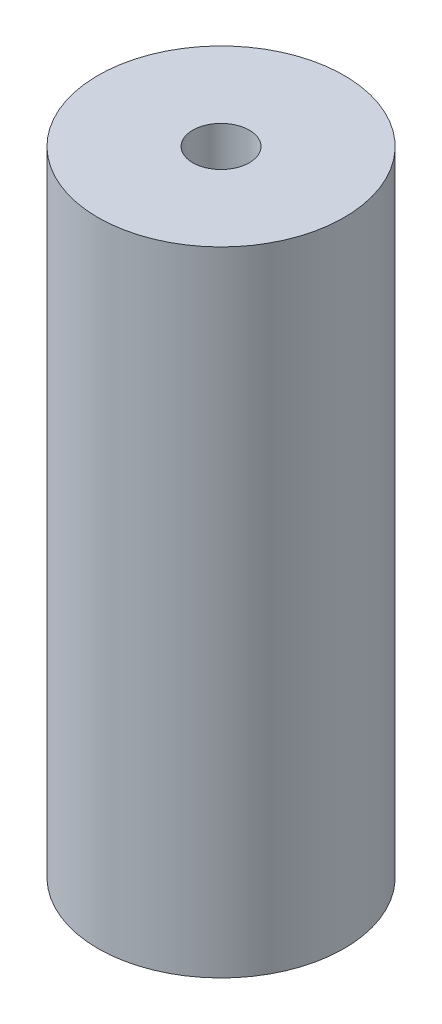
ISO-10303-21;
HEADER;
FILE_DESCRIPTION(('STEP AP214'),'2;1');
FILE_NAME('part.step','',(''),(''),'','','');
FILE_SCHEMA(('AUTOMOTIVE_DESIGN { 1 0 10303 214 1 1 1 1 }'));
ENDSEC;
DATA;
#1=APPLICATION_CONTEXT('core data for automotive mechanical design processes');
#2=APPLICATION_PROTOCOL_DEFINITION('international standard','automotive_design',2000,#1);
#3=PRODUCT_CONTEXT('',#1,'mechanical');
#4=PRODUCT('Part','Part','',(#3));
#5=PRODUCT_RELATED_PRODUCT_CATEGORY('part','',(#4));
#6=PRODUCT_DEFINITION_FORMATION('','',#4);
#7=PRODUCT_DEFINITION_CONTEXT('part definition',#1,'design');
#8=PRODUCT_DEFINITION('design','',#6,#7);
#9=PRODUCT_DEFINITION_SHAPE('','',#8);
#10=(LENGTH_UNIT() NAMED_UNIT(*) SI_UNIT(.MILLI.,.METRE.));
#11=(NAMED_UNIT(*) PLANE_ANGLE_UNIT() SI_UNIT($,.RADIAN.));
#12=(NAMED_UNIT(*) SI_UNIT($,.STERADIAN.) SOLID_ANGLE_UNIT());
#13=UNCERTAINTY_MEASURE_WITH_UNIT(LENGTH_MEASURE(1.E-05),#10,'distance_accuracy_value','');
#14=(GEOMETRIC_REPRESENTATION_CONTEXT(3) GLOBAL_UNCERTAINTY_ASSIGNED_CONTEXT((#13)) GLOBAL_UNIT_ASSIGNED_CONTEXT((#10,
#11,#12)) REPRESENTATION_CONTEXT('',''));
#15=CARTESIAN_POINT('',(0.,0.,0.));
#16=DIRECTION('',(0.,0.,1.));
#17=DIRECTION('',(1.,0.,0.));
#18=AXIS2_PLACEMENT_3D('',#15,#16,#17);
#19=CARTESIAN_POINT('',(0.,41.8337999999494,0.));
#20=DIRECTION('',(0.,1.,0.));
#21=DIRECTION('',(0.,0.,1.));
#22=AXIS2_PLACEMENT_3D('',#19,#20,#21);
#23=CONICAL_SURFACE('',#22,2.55269999979646,1.02974425855671);
#24=CARTESIAN_POINT('',(2.27373675443232E-10,40.2999830977535,0.));
#25=VERTEX_POINT('',#24);
#26=VERTEX_LOOP('',#25);
#27=FACE_BOUND('',#26,.T.);
#28=CARTESIAN_POINT('',(0.,41.8338,0.));
#29=DIRECTION('',(0.,1.,0.));
#30=DIRECTION('',(0.,0.,1.));
#31=AXIS2_PLACEMENT_3D('',#28,#29,#30);
#32=CIRCLE('',#31,2.5527);
#33=CARTESIAN_POINT('',(0.,41.8338,2.5527));
#34=VERTEX_POINT('',#33);
#35=EDGE_CURVE('E37',#34,#34,#32,.T.);
#36=ORIENTED_EDGE('',*,*,#35,.T.);
#37=EDGE_LOOP('',(#36));
#38=FACE_BOUND('',#37,.T.);
#39=ADVANCED_FACE('F17',(#27,#38),#23,.F.);
#40=CARTESIAN_POINT('',(0.,23.825200000033,0.));
#41=DIRECTION('',(0.,-1.,0.));
#42=DIRECTION('',(0.,0.,-1.));
#43=AXIS2_PLACEMENT_3D('',#40,#41,#42);
#44=CONICAL_SURFACE('',#43,3.96874999995589,1.02974425868158);
#45=CARTESIAN_POINT('',(0.,23.8252,0.));
#46=DIRECTION('',(0.,-1.,0.));
#47=DIRECTION('',(0.,0.,-1.));
#48=AXIS2_PLACEMENT_3D('',#45,#46,#47);
#49=CIRCLE('',#48,3.96875);
#50=CARTESIAN_POINT('',(0.,23.8252,-3.96875));
#51=VERTEX_POINT('',#50);
#52=EDGE_CURVE('E39',#51,#51,#49,.T.);
#53=ORIENTED_EDGE('',*,*,#52,.T.);
#54=EDGE_LOOP('',(#53));
#55=FACE_BOUND('',#54,.T.);
#56=CARTESIAN_POINT('',(0.,26.2098655816771,0.));
#57=VERTEX_POINT('',#56);
#58=VERTEX_LOOP('',#57);
#59=FACE_BOUND('',#58,.T.);
#60=ADVANCED_FACE('F34',(#55,#59),#44,.F.);
#61=CARTESIAN_POINT('',(0.,39.4574822526958,0.));
#62=DIRECTION('',(0.,1.,0.));
#63=DIRECTION('',(0.,0.,1.));
#64=AXIS2_PLACEMENT_3D('',#61,#62,#63);
#65=CYLINDRICAL_SURFACE('',#64,2.5527);
#66=ORIENTED_EDGE('',*,*,#35,.F.);
#67=EDGE_LOOP('',(#66));
#68=FACE_BOUND('',#67,.T.);
#69=CARTESIAN_POINT('',(0.,57.15,0.));
#70=DIRECTION('',(0.,1.,0.));
#71=DIRECTION('',(0.,0.,1.));
#72=AXIS2_PLACEMENT_3D('',#69,#70,#71);
#73=CIRCLE('',#72,2.5527);
#74=CARTESIAN_POINT('',(0.,57.15,2.5527));
#75=VERTEX_POINT('',#74);
#76=EDGE_CURVE('E20',#75,#75,#73,.F.);
#77=ORIENTED_EDGE('',*,*,#76,.F.);
#78=EDGE_LOOP('',(#77));
#79=FACE_BOUND('',#78,.T.);
#80=ADVANCED_FACE('F55',(#68,#79),#65,.F.);
#81=CARTESIAN_POINT('',(0.,27.5203588608486,0.));
#82=DIRECTION('',(0.,-1.,0.));
#83=DIRECTION('',(0.,0.,-1.));
#84=AXIS2_PLACEMENT_3D('',#81,#82,#83);
#85=CYLINDRICAL_SURFACE('',#84,3.96875);
#86=ORIENTED_EDGE('',*,*,#52,.F.);
#87=EDGE_LOOP('',(#86));
#88=FACE_BOUND('',#87,.T.);
#89=CARTESIAN_POINT('',(0.,0.,0.));
#90=DIRECTION('',(0.,-1.,0.));
#91=DIRECTION('',(0.,0.,-1.));
#92=AXIS2_PLACEMENT_3D('',#89,#90,#91);
#93=CIRCLE('',#92,3.96875);
#94=CARTESIAN_POINT('',(0.,0.,-3.96875));
#95=VERTEX_POINT('',#94);
#96=EDGE_CURVE('E45',#95,#95,#93,.T.);
#97=ORIENTED_EDGE('',*,*,#96,.T.);
#98=EDGE_LOOP('',(#97));
#99=FACE_BOUND('',#98,.T.);
#100=ADVANCED_FACE('F57',(#88,#99),#85,.F.);
#101=CARTESIAN_POINT('',(0.,57.15,0.));
#102=DIRECTION('',(0.,1.,0.));
#103=DIRECTION('',(0.,0.,1.));
#104=AXIS2_PLACEMENT_3D('',#101,#102,#103);
#105=PLANE('',#104);
#106=ORIENTED_EDGE('',*,*,#76,.T.);
#107=EDGE_LOOP('',(#106));
#108=FACE_BOUND('',#107,.T.);
#109=CARTESIAN_POINT('',(0.,57.15,0.));
#110=DIRECTION('',(0.,1.,0.));
#111=DIRECTION('',(0.,0.,1.));
#112=AXIS2_PLACEMENT_3D('',#109,#110,#111);
#113=CIRCLE('',#112,11.1125);
#114=CARTESIAN_POINT('',(0.,57.15,11.1125));
#115=VERTEX_POINT('',#114);
#116=EDGE_CURVE('E26',#115,#115,#113,.F.);
#117=ORIENTED_EDGE('',*,*,#116,.F.);
#118=EDGE_LOOP('',(#117));
#119=FACE_BOUND('',#118,.T.);
#120=ADVANCED_FACE('F52',(#108,#119),#105,.T.);
#121=CARTESIAN_POINT('',(0.,0.,0.));
#122=DIRECTION('',(0.,1.,0.));
#123=DIRECTION('',(0.,0.,1.));
#124=AXIS2_PLACEMENT_3D('',#121,#122,#123);
#125=PLANE('',#124);
#126=ORIENTED_EDGE('',*,*,#96,.F.);
#127=EDGE_LOOP('',(#126));
#128=FACE_BOUND('',#127,.T.);
#129=CARTESIAN_POINT('',(0.,0.,0.));
#130=DIRECTION('',(0.,1.,0.));
#131=DIRECTION('',(0.,0.,1.));
#132=AXIS2_PLACEMENT_3D('',#129,#130,#131);
#133=CIRCLE('',#132,11.1125);
#134=CARTESIAN_POINT('',(0.,0.,11.1125));
#135=VERTEX_POINT('',#134);
#136=EDGE_CURVE('E11',#135,#135,#133,.T.);
#137=ORIENTED_EDGE('',*,*,#136,.F.);
#138=EDGE_LOOP('',(#137));
#139=FACE_BOUND('',#138,.T.);
#140=ADVANCED_FACE('F69',(#128,#139),#125,.F.);
#141=CARTESIAN_POINT('',(0.,0.,0.));
#142=DIRECTION('',(0.,1.,0.));
#143=DIRECTION('',(0.,0.,1.));
#144=AXIS2_PLACEMENT_3D('',#141,#142,#143);
#145=CYLINDRICAL_SURFACE('',#144,11.1125);
#146=ORIENTED_EDGE('',*,*,#116,.T.);
#147=EDGE_LOOP('',(#146));
#148=FACE_BOUND('',#147,.T.);
#149=ORIENTED_EDGE('',*,*,#136,.T.);
#150=EDGE_LOOP('',(#149));
#151=FACE_BOUND('',#150,.T.);
#152=ADVANCED_FACE('F67',(#148,#151),#145,.T.);
#153=CLOSED_SHELL('',(#39,#60,#80,#100,#120,#140,#152));
#154=MANIFOLD_SOLID_BREP('B1',#153);
#155=ADVANCED_BREP_SHAPE_REPRESENTATION('',(#18,#154),#14);
#156=SHAPE_DEFINITION_REPRESENTATION(#9,#155);
ENDSEC;
END-ISO-10303-21;
